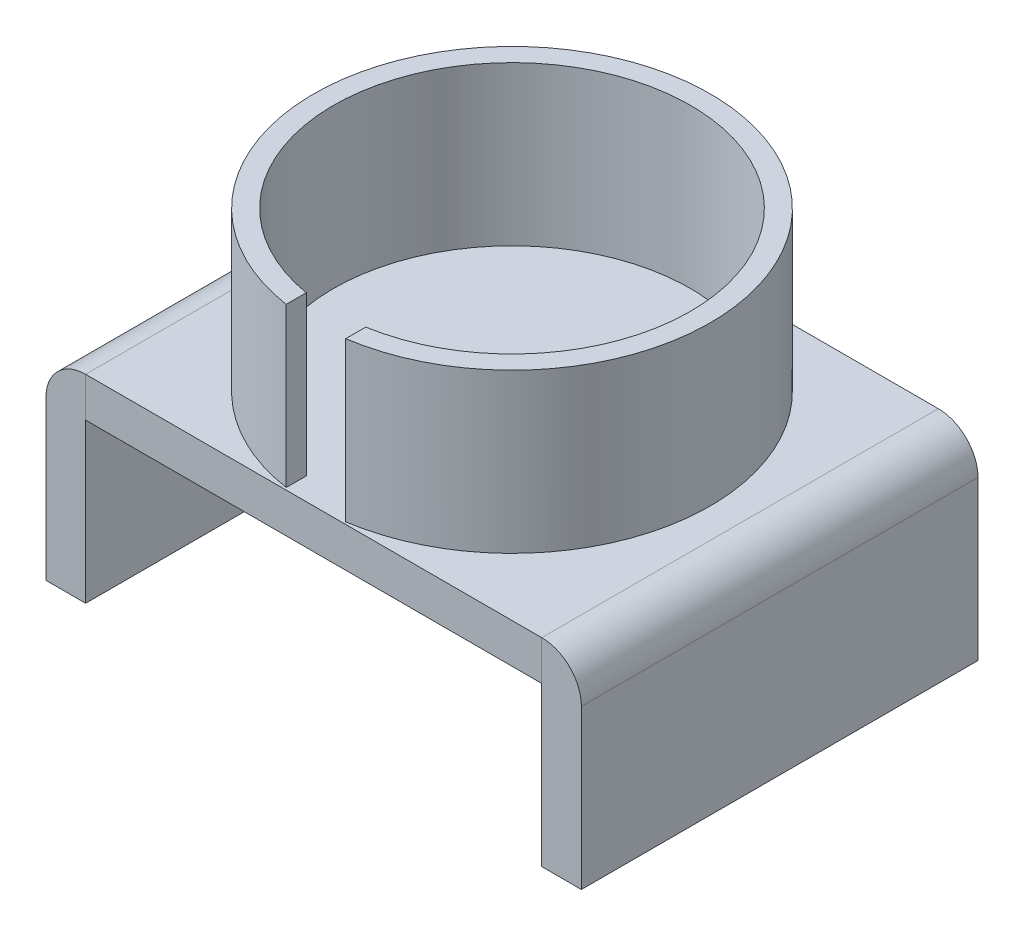
ISO-10303-21;
HEADER;
FILE_DESCRIPTION(('STEP AP214'),'2;1');
FILE_NAME('part.step','',(''),(''),'','','');
FILE_SCHEMA(('AUTOMOTIVE_DESIGN { 1 0 10303 214 1 1 1 1 }'));
ENDSEC;
DATA;
#1=APPLICATION_CONTEXT('core data for automotive mechanical design processes');
#2=APPLICATION_PROTOCOL_DEFINITION('international standard','automotive_design',2000,#1);
#3=PRODUCT_CONTEXT('',#1,'mechanical');
#4=PRODUCT('Part','Part','',(#3));
#5=PRODUCT_RELATED_PRODUCT_CATEGORY('part','',(#4));
#6=PRODUCT_DEFINITION_FORMATION('','',#4);
#7=PRODUCT_DEFINITION_CONTEXT('part definition',#1,'design');
#8=PRODUCT_DEFINITION('design','',#6,#7);
#9=PRODUCT_DEFINITION_SHAPE('','',#8);
#10=(LENGTH_UNIT() NAMED_UNIT(*) SI_UNIT(.MILLI.,.METRE.));
#11=(NAMED_UNIT(*) PLANE_ANGLE_UNIT() SI_UNIT($,.RADIAN.));
#12=(NAMED_UNIT(*) SI_UNIT($,.STERADIAN.) SOLID_ANGLE_UNIT());
#13=UNCERTAINTY_MEASURE_WITH_UNIT(LENGTH_MEASURE(1.E-05),#10,'distance_accuracy_value','');
#14=(GEOMETRIC_REPRESENTATION_CONTEXT(3) GLOBAL_UNCERTAINTY_ASSIGNED_CONTEXT((#13)) GLOBAL_UNIT_ASSIGNED_CONTEXT((#10,
#11,#12)) REPRESENTATION_CONTEXT('',''));
#15=CARTESIAN_POINT('',(0.,0.,0.));
#16=DIRECTION('',(0.,0.,1.));
#17=DIRECTION('',(1.,0.,0.));
#18=AXIS2_PLACEMENT_3D('',#15,#16,#17);
#19=CARTESIAN_POINT('',(-58.307962529274,0.,37.7049180327869));
#20=DIRECTION('',(0.,0.,-1.));
#21=DIRECTION('',(-1.,0.,0.));
#22=AXIS2_PLACEMENT_3D('',#19,#20,#21);
#23=CYLINDRICAL_SURFACE('',#22,10.);
#24=DIRECTION('',(0.,0.,-1.));
#25=VECTOR('',#24,1.);
#26=CARTESIAN_POINT('',(-68.307962529274,0.,37.7049180327869));
#27=LINE('',#26,#25);
#28=CARTESIAN_POINT('',(-68.307962529274,0.,37.7049180327869));
#29=VERTEX_POINT('',#28);
#30=CARTESIAN_POINT('',(-68.307962529274,0.,-62.2950819672131));
#31=VERTEX_POINT('',#30);
#32=EDGE_CURVE('E118',#29,#31,#27,.T.);
#33=ORIENTED_EDGE('',*,*,#32,.F.);
#34=CARTESIAN_POINT('',(-58.307962529274,0.,37.7049180327869));
#35=DIRECTION('',(0.,0.,1.));
#36=DIRECTION('',(1.,0.,0.));
#37=AXIS2_PLACEMENT_3D('',#34,#35,#36);
#38=CIRCLE('',#37,10.);
#39=CARTESIAN_POINT('',(-58.307962529274,10.,37.7049180327869));
#40=VERTEX_POINT('',#39);
#41=EDGE_CURVE('E59',#40,#29,#38,.T.);
#42=ORIENTED_EDGE('',*,*,#41,.F.);
#43=DIRECTION('',(0.,0.,1.));
#44=VECTOR('',#43,1.);
#45=CARTESIAN_POINT('',(-58.307962529274,10.,37.7049180327869));
#46=LINE('',#45,#44);
#47=CARTESIAN_POINT('',(-58.307962529274,10.,-62.2950819672131));
#48=VERTEX_POINT('',#47);
#49=EDGE_CURVE('E95',#48,#40,#46,.T.);
#50=ORIENTED_EDGE('',*,*,#49,.F.);
#51=CARTESIAN_POINT('',(-58.307962529274,0.,-62.2950819672131));
#52=DIRECTION('',(0.,0.,-1.));
#53=DIRECTION('',(-1.,0.,0.));
#54=AXIS2_PLACEMENT_3D('',#51,#52,#53);
#55=CIRCLE('',#54,10.);
#56=EDGE_CURVE('E12',#31,#48,#55,.T.);
#57=ORIENTED_EDGE('',*,*,#56,.F.);
#58=EDGE_LOOP('',(#33,#42,#50,#57));
#59=FACE_BOUND('',#58,.T.);
#60=ADVANCED_FACE('F52',(#59),#23,.T.);
#61=CARTESIAN_POINT('',(-58.307962529274,10.,37.7049180327869));
#62=DIRECTION('',(1.,0.,0.));
#63=DIRECTION('',(0.,0.,-1.));
#64=AXIS2_PLACEMENT_3D('',#61,#62,#63);
#65=PLANE('',#64);
#66=DIRECTION('',(0.,-1.,0.));
#67=VECTOR('',#66,1.);
#68=CARTESIAN_POINT('',(-58.307962529274,10.,37.7049180327869));
#69=LINE('',#68,#67);
#70=CARTESIAN_POINT('',(-58.307962529274,-40.,37.7049180327869));
#71=VERTEX_POINT('',#70);
#72=EDGE_CURVE('E89',#40,#71,#69,.T.);
#73=ORIENTED_EDGE('',*,*,#72,.T.);
#74=DIRECTION('',(0.,0.,1.));
#75=VECTOR('',#74,1.);
#76=CARTESIAN_POINT('',(-58.307962529274,-40.,37.7049180327869));
#77=LINE('',#76,#75);
#78=CARTESIAN_POINT('',(-58.307962529274,-40.,-62.2950819672131));
#79=VERTEX_POINT('',#78);
#80=EDGE_CURVE('E94',#79,#71,#77,.T.);
#81=ORIENTED_EDGE('',*,*,#80,.F.);
#82=DIRECTION('',(0.,-1.,0.));
#83=VECTOR('',#82,1.);
#84=CARTESIAN_POINT('',(-58.307962529274,10.,-62.2950819672131));
#85=LINE('',#84,#83);
#86=EDGE_CURVE('E116',#48,#79,#85,.T.);
#87=ORIENTED_EDGE('',*,*,#86,.F.);
#88=ORIENTED_EDGE('',*,*,#49,.T.);
#89=EDGE_LOOP('',(#73,#81,#87,#88));
#90=FACE_BOUND('',#89,.T.);
#91=ADVANCED_FACE('F91',(#90),#65,.T.);
#92=CARTESIAN_POINT('',(-58.307962529274,10.,-62.2950819672131));
#93=DIRECTION('',(0.,0.,-1.));
#94=DIRECTION('',(-1.,0.,0.));
#95=AXIS2_PLACEMENT_3D('',#92,#93,#94);
#96=PLANE('',#95);
#97=DIRECTION('',(0.,-1.,0.));
#98=VECTOR('',#97,1.);
#99=CARTESIAN_POINT('',(-68.307962529274,10.,-62.2950819672131));
#100=LINE('',#99,#98);
#101=CARTESIAN_POINT('',(-68.307962529274,-40.,-62.2950819672131));
#102=VERTEX_POINT('',#101);
#103=EDGE_CURVE('E119',#31,#102,#100,.T.);
#104=ORIENTED_EDGE('',*,*,#103,.F.);
#105=ORIENTED_EDGE('',*,*,#56,.T.);
#106=ORIENTED_EDGE('',*,*,#86,.T.);
#107=DIRECTION('',(1.,0.,0.));
#108=VECTOR('',#107,1.);
#109=CARTESIAN_POINT('',(-58.307962529274,-40.,-62.2950819672131));
#110=LINE('',#109,#108);
#111=EDGE_CURVE('E110',#102,#79,#110,.T.);
#112=ORIENTED_EDGE('',*,*,#111,.F.);
#113=EDGE_LOOP('',(#104,#105,#106,#112));
#114=FACE_BOUND('',#113,.T.);
#115=ADVANCED_FACE('F126',(#114),#96,.T.);
#116=CARTESIAN_POINT('',(-68.307962529274,10.,37.7049180327869));
#117=DIRECTION('',(-1.,0.,0.));
#118=DIRECTION('',(0.,0.,1.));
#119=AXIS2_PLACEMENT_3D('',#116,#117,#118);
#120=PLANE('',#119);
#121=DIRECTION('',(0.,-1.,0.));
#122=VECTOR('',#121,1.);
#123=CARTESIAN_POINT('',(-68.307962529274,10.,37.7049180327869));
#124=LINE('',#123,#122);
#125=CARTESIAN_POINT('',(-68.307962529274,-40.,37.7049180327869));
#126=VERTEX_POINT('',#125);
#127=EDGE_CURVE('E96',#29,#126,#124,.T.);
#128=ORIENTED_EDGE('',*,*,#127,.F.);
#129=ORIENTED_EDGE('',*,*,#32,.T.);
#130=ORIENTED_EDGE('',*,*,#103,.T.);
#131=DIRECTION('',(0.,0.,-1.));
#132=VECTOR('',#131,1.);
#133=CARTESIAN_POINT('',(-68.307962529274,-40.,37.7049180327869));
#134=LINE('',#133,#132);
#135=EDGE_CURVE('E105',#126,#102,#134,.T.);
#136=ORIENTED_EDGE('',*,*,#135,.F.);
#137=EDGE_LOOP('',(#128,#129,#130,#136));
#138=FACE_BOUND('',#137,.T.);
#139=ADVANCED_FACE('F124',(#138),#120,.T.);
#140=CARTESIAN_POINT('',(-58.307962529274,10.,37.7049180327869));
#141=DIRECTION('',(0.,0.,1.));
#142=DIRECTION('',(1.,0.,0.));
#143=AXIS2_PLACEMENT_3D('',#140,#141,#142);
#144=PLANE('',#143);
#145=ORIENTED_EDGE('',*,*,#72,.F.);
#146=ORIENTED_EDGE('',*,*,#41,.T.);
#147=ORIENTED_EDGE('',*,*,#127,.T.);
#148=DIRECTION('',(-1.,0.,0.));
#149=VECTOR('',#148,1.);
#150=CARTESIAN_POINT('',(-58.307962529274,-40.,37.7049180327869));
#151=LINE('',#150,#149);
#152=EDGE_CURVE('E99',#71,#126,#151,.T.);
#153=ORIENTED_EDGE('',*,*,#152,.F.);
#154=EDGE_LOOP('',(#145,#146,#147,#153));
#155=FACE_BOUND('',#154,.T.);
#156=ADVANCED_FACE('F100',(#155),#144,.T.);
#157=CARTESIAN_POINT('',(0.,-40.,0.));
#158=DIRECTION('',(0.,1.,0.));
#159=DIRECTION('',(0.,0.,1.));
#160=AXIS2_PLACEMENT_3D('',#157,#158,#159);
#161=PLANE('',#160);
#162=ORIENTED_EDGE('',*,*,#80,.T.);
#163=ORIENTED_EDGE('',*,*,#152,.T.);
#164=ORIENTED_EDGE('',*,*,#135,.T.);
#165=ORIENTED_EDGE('',*,*,#111,.T.);
#166=EDGE_LOOP('',(#162,#163,#164,#165));
#167=FACE_BOUND('',#166,.T.);
#168=ADVANCED_FACE('F108',(#167),#161,.F.);
#169=CLOSED_SHELL('',(#60,#91,#115,#139,#156,#168));
#170=MANIFOLD_SOLID_BREP('B2',#169);
#171=CARTESIAN_POINT('',(56.692037470726,0.,0.));
#172=DIRECTION('',(0.,0.,1.));
#173=DIRECTION('',(1.,0.,0.));
#174=AXIS2_PLACEMENT_3D('',#171,#172,#173);
#175=CYLINDRICAL_SURFACE('',#174,10.);
#176=DIRECTION('',(0.,0.,-1.));
#177=VECTOR('',#176,1.);
#178=CARTESIAN_POINT('',(56.692037470726,10.,37.7049180327869));
#179=LINE('',#178,#177);
#180=CARTESIAN_POINT('',(56.692037470726,10.,37.7049180327869));
#181=VERTEX_POINT('',#180);
#182=CARTESIAN_POINT('',(56.692037470726,10.,-62.2950819672131));
#183=VERTEX_POINT('',#182);
#184=EDGE_CURVE('E228',#181,#183,#179,.T.);
#185=ORIENTED_EDGE('',*,*,#184,.F.);
#186=CARTESIAN_POINT('',(56.692037470726,0.,37.7049180327869));
#187=DIRECTION('',(0.,0.,1.));
#188=DIRECTION('',(1.,0.,0.));
#189=AXIS2_PLACEMENT_3D('',#186,#187,#188);
#190=CIRCLE('',#189,10.);
#191=CARTESIAN_POINT('',(66.692037470726,0.,37.7049180327869));
#192=VERTEX_POINT('',#191);
#193=EDGE_CURVE('E192',#192,#181,#190,.T.);
#194=ORIENTED_EDGE('',*,*,#193,.F.);
#195=DIRECTION('',(0.,0.,-1.));
#196=VECTOR('',#195,1.);
#197=CARTESIAN_POINT('',(66.692037470726,0.,0.));
#198=LINE('',#197,#196);
#199=CARTESIAN_POINT('',(66.692037470726,0.,-62.2950819672131));
#200=VERTEX_POINT('',#199);
#201=EDGE_CURVE('E251',#200,#192,#198,.F.);
#202=ORIENTED_EDGE('',*,*,#201,.F.);
#203=CARTESIAN_POINT('',(56.692037470726,0.,-62.2950819672131));
#204=DIRECTION('',(0.,0.,-1.));
#205=DIRECTION('',(-1.,0.,0.));
#206=AXIS2_PLACEMENT_3D('',#203,#204,#205);
#207=CIRCLE('',#206,10.);
#208=EDGE_CURVE('E50',#183,#200,#207,.T.);
#209=ORIENTED_EDGE('',*,*,#208,.F.);
#210=EDGE_LOOP('',(#185,#194,#202,#209));
#211=FACE_BOUND('',#210,.T.);
#212=ADVANCED_FACE('F185',(#211),#175,.T.);
#213=CARTESIAN_POINT('',(56.692037470726,10.,37.7049180327869));
#214=DIRECTION('',(-1.,0.,0.));
#215=DIRECTION('',(0.,0.,1.));
#216=AXIS2_PLACEMENT_3D('',#213,#214,#215);
#217=PLANE('',#216);
#218=DIRECTION('',(0.,-1.,0.));
#219=VECTOR('',#218,1.);
#220=CARTESIAN_POINT('',(56.692037470726,10.,-62.2950819672131));
#221=LINE('',#220,#219);
#222=CARTESIAN_POINT('',(56.692037470726,-40.,-62.2950819672131));
#223=VERTEX_POINT('',#222);
#224=EDGE_CURVE('E222',#183,#223,#221,.T.);
#225=ORIENTED_EDGE('',*,*,#224,.T.);
#226=DIRECTION('',(0.,0.,-1.));
#227=VECTOR('',#226,1.);
#228=CARTESIAN_POINT('',(56.692037470726,-40.,37.7049180327869));
#229=LINE('',#228,#227);
#230=CARTESIAN_POINT('',(56.692037470726,-40.,37.7049180327869));
#231=VERTEX_POINT('',#230);
#232=EDGE_CURVE('E227',#231,#223,#229,.T.);
#233=ORIENTED_EDGE('',*,*,#232,.F.);
#234=DIRECTION('',(0.,-1.,0.));
#235=VECTOR('',#234,1.);
#236=CARTESIAN_POINT('',(56.692037470726,10.,37.7049180327869));
#237=LINE('',#236,#235);
#238=EDGE_CURVE('E249',#181,#231,#237,.T.);
#239=ORIENTED_EDGE('',*,*,#238,.F.);
#240=ORIENTED_EDGE('',*,*,#184,.T.);
#241=EDGE_LOOP('',(#225,#233,#239,#240));
#242=FACE_BOUND('',#241,.T.);
#243=ADVANCED_FACE('F224',(#242),#217,.T.);
#244=CARTESIAN_POINT('',(56.692037470726,10.,37.7049180327869));
#245=DIRECTION('',(0.,0.,1.));
#246=DIRECTION('',(1.,0.,0.));
#247=AXIS2_PLACEMENT_3D('',#244,#245,#246);
#248=PLANE('',#247);
#249=DIRECTION('',(0.,-1.,0.));
#250=VECTOR('',#249,1.);
#251=CARTESIAN_POINT('',(66.692037470726,10.,37.7049180327869));
#252=LINE('',#251,#250);
#253=CARTESIAN_POINT('',(66.692037470726,-40.,37.7049180327869));
#254=VERTEX_POINT('',#253);
#255=EDGE_CURVE('E252',#192,#254,#252,.T.);
#256=ORIENTED_EDGE('',*,*,#255,.F.);
#257=ORIENTED_EDGE('',*,*,#193,.T.);
#258=ORIENTED_EDGE('',*,*,#238,.T.);
#259=DIRECTION('',(-1.,0.,0.));
#260=VECTOR('',#259,1.);
#261=CARTESIAN_POINT('',(56.692037470726,-40.,37.7049180327869));
#262=LINE('',#261,#260);
#263=EDGE_CURVE('E243',#254,#231,#262,.T.);
#264=ORIENTED_EDGE('',*,*,#263,.F.);
#265=EDGE_LOOP('',(#256,#257,#258,#264));
#266=FACE_BOUND('',#265,.T.);
#267=ADVANCED_FACE('F257',(#266),#248,.T.);
#268=CARTESIAN_POINT('',(66.692037470726,10.,37.7049180327869));
#269=DIRECTION('',(1.,0.,0.));
#270=DIRECTION('',(0.,0.,-1.));
#271=AXIS2_PLACEMENT_3D('',#268,#269,#270);
#272=PLANE('',#271);
#273=DIRECTION('',(0.,-1.,0.));
#274=VECTOR('',#273,1.);
#275=CARTESIAN_POINT('',(66.692037470726,10.,-62.2950819672131));
#276=LINE('',#275,#274);
#277=CARTESIAN_POINT('',(66.692037470726,-40.,-62.2950819672131));
#278=VERTEX_POINT('',#277);
#279=EDGE_CURVE('E229',#200,#278,#276,.T.);
#280=ORIENTED_EDGE('',*,*,#279,.F.);
#281=ORIENTED_EDGE('',*,*,#201,.T.);
#282=ORIENTED_EDGE('',*,*,#255,.T.);
#283=DIRECTION('',(0.,0.,1.));
#284=VECTOR('',#283,1.);
#285=CARTESIAN_POINT('',(66.692037470726,-40.,37.7049180327869));
#286=LINE('',#285,#284);
#287=EDGE_CURVE('E238',#278,#254,#286,.T.);
#288=ORIENTED_EDGE('',*,*,#287,.F.);
#289=EDGE_LOOP('',(#280,#281,#282,#288));
#290=FACE_BOUND('',#289,.T.);
#291=ADVANCED_FACE('F259',(#290),#272,.T.);
#292=CARTESIAN_POINT('',(56.692037470726,10.,-62.2950819672131));
#293=DIRECTION('',(0.,0.,-1.));
#294=DIRECTION('',(-1.,0.,0.));
#295=AXIS2_PLACEMENT_3D('',#292,#293,#294);
#296=PLANE('',#295);
#297=ORIENTED_EDGE('',*,*,#224,.F.);
#298=ORIENTED_EDGE('',*,*,#208,.T.);
#299=ORIENTED_EDGE('',*,*,#279,.T.);
#300=DIRECTION('',(1.,0.,0.));
#301=VECTOR('',#300,1.);
#302=CARTESIAN_POINT('',(56.692037470726,-40.,-62.2950819672131));
#303=LINE('',#302,#301);
#304=EDGE_CURVE('E232',#223,#278,#303,.T.);
#305=ORIENTED_EDGE('',*,*,#304,.F.);
#306=EDGE_LOOP('',(#297,#298,#299,#305));
#307=FACE_BOUND('',#306,.T.);
#308=ADVANCED_FACE('F233',(#307),#296,.T.);
#309=CARTESIAN_POINT('',(0.,-40.,0.));
#310=DIRECTION('',(0.,-1.,0.));
#311=DIRECTION('',(0.,0.,-1.));
#312=AXIS2_PLACEMENT_3D('',#309,#310,#311);
#313=PLANE('',#312);
#314=ORIENTED_EDGE('',*,*,#232,.T.);
#315=ORIENTED_EDGE('',*,*,#304,.T.);
#316=ORIENTED_EDGE('',*,*,#287,.T.);
#317=ORIENTED_EDGE('',*,*,#263,.T.);
#318=EDGE_LOOP('',(#314,#315,#316,#317));
#319=FACE_BOUND('',#318,.T.);
#320=ADVANCED_FACE('F241',(#319),#313,.T.);
#321=CLOSED_SHELL('',(#212,#243,#267,#291,#308,#320));
#322=MANIFOLD_SOLID_BREP('B6',#321);
#323=CARTESIAN_POINT('',(-58.307962529274,10.,-62.2950819672131));
#324=DIRECTION('',(1.,0.,0.));
#325=DIRECTION('',(0.,0.,-1.));
#326=AXIS2_PLACEMENT_3D('',#323,#324,#325);
#327=PLANE('',#326);
#328=DIRECTION('',(0.,0.,1.));
#329=VECTOR('',#328,1.);
#330=CARTESIAN_POINT('',(-58.307962529274,0.,-62.2950819672131));
#331=LINE('',#330,#329);
#332=CARTESIAN_POINT('',(-58.307962529274,0.,-62.2950819672131));
#333=VERTEX_POINT('',#332);
#334=CARTESIAN_POINT('',(-58.307962529274,0.,37.7049180327869));
#335=VERTEX_POINT('',#334);
#336=EDGE_CURVE('E402',#333,#335,#331,.T.);
#337=ORIENTED_EDGE('',*,*,#336,.T.);
#338=DIRECTION('',(0.,-1.,0.));
#339=VECTOR('',#338,1.);
#340=CARTESIAN_POINT('',(-58.307962529274,10.,37.7049180327869));
#341=LINE('',#340,#339);
#342=CARTESIAN_POINT('',(-58.307962529274,10.,37.7049180327869));
#343=VERTEX_POINT('',#342);
#344=EDGE_CURVE('E312',#343,#335,#341,.T.);
#345=ORIENTED_EDGE('',*,*,#344,.F.);
#346=DIRECTION('',(0.,0.,1.));
#347=VECTOR('',#346,1.);
#348=CARTESIAN_POINT('',(-58.307962529274,10.,-62.2950819672131));
#349=LINE('',#348,#347);
#350=CARTESIAN_POINT('',(-58.307962529274,10.,-62.2950819672131));
#351=VERTEX_POINT('',#350);
#352=EDGE_CURVE('E413',#351,#343,#349,.T.);
#353=ORIENTED_EDGE('',*,*,#352,.F.);
#354=DIRECTION('',(0.,-1.,0.));
#355=VECTOR('',#354,1.);
#356=CARTESIAN_POINT('',(-58.307962529274,10.,-62.2950819672131));
#357=LINE('',#356,#355);
#358=EDGE_CURVE('E428',#351,#333,#357,.T.);
#359=ORIENTED_EDGE('',*,*,#358,.T.);
#360=EDGE_LOOP('',(#337,#345,#353,#359));
#361=FACE_BOUND('',#360,.T.);
#362=ADVANCED_FACE('F309',(#361),#327,.F.);
#363=CARTESIAN_POINT('',(-58.307962529274,10.,37.7049180327869));
#364=DIRECTION('',(0.,0.,-1.));
#365=DIRECTION('',(-1.,0.,0.));
#366=AXIS2_PLACEMENT_3D('',#363,#364,#365);
#367=PLANE('',#366);
#368=DIRECTION('',(1.,0.,0.));
#369=VECTOR('',#368,1.);
#370=CARTESIAN_POINT('',(-58.307962529274,0.,37.7049180327869));
#371=LINE('',#370,#369);
#372=CARTESIAN_POINT('',(56.692037470726,0.,37.7049180327869));
#373=VERTEX_POINT('',#372);
#374=EDGE_CURVE('E407',#335,#373,#371,.T.);
#375=ORIENTED_EDGE('',*,*,#374,.T.);
#376=DIRECTION('',(0.,-1.,0.));
#377=VECTOR('',#376,1.);
#378=CARTESIAN_POINT('',(56.692037470726,10.,37.7049180327869));
#379=LINE('',#378,#377);
#380=CARTESIAN_POINT('',(56.692037470726,10.,37.7049180327869));
#381=VERTEX_POINT('',#380);
#382=EDGE_CURVE('E443',#381,#373,#379,.T.);
#383=ORIENTED_EDGE('',*,*,#382,.F.);
#384=DIRECTION('',(1.,0.,0.));
#385=VECTOR('',#384,1.);
#386=CARTESIAN_POINT('',(-58.307962529274,10.,37.7049180327869));
#387=LINE('',#386,#385);
#388=EDGE_CURVE('E417',#343,#381,#387,.T.);
#389=ORIENTED_EDGE('',*,*,#388,.F.);
#390=ORIENTED_EDGE('',*,*,#344,.T.);
#391=EDGE_LOOP('',(#375,#383,#389,#390));
#392=FACE_BOUND('',#391,.T.);
#393=ADVANCED_FACE('F454',(#392),#367,.F.);
#394=CARTESIAN_POINT('',(56.692037470726,10.,-62.2950819672131));
#395=DIRECTION('',(-1.,0.,0.));
#396=DIRECTION('',(0.,0.,1.));
#397=AXIS2_PLACEMENT_3D('',#394,#395,#396);
#398=PLANE('',#397);
#399=DIRECTION('',(0.,0.,-1.));
#400=VECTOR('',#399,1.);
#401=CARTESIAN_POINT('',(56.692037470726,0.,-62.2950819672131));
#402=LINE('',#401,#400);
#403=CARTESIAN_POINT('',(56.692037470726,0.,-62.2950819672131));
#404=VERTEX_POINT('',#403);
#405=EDGE_CURVE('E432',#373,#404,#402,.T.);
#406=ORIENTED_EDGE('',*,*,#405,.T.);
#407=DIRECTION('',(0.,-1.,0.));
#408=VECTOR('',#407,1.);
#409=CARTESIAN_POINT('',(56.692037470726,10.,-62.2950819672131));
#410=LINE('',#409,#408);
#411=CARTESIAN_POINT('',(56.692037470726,10.,-62.2950819672131));
#412=VERTEX_POINT('',#411);
#413=EDGE_CURVE('E440',#412,#404,#410,.T.);
#414=ORIENTED_EDGE('',*,*,#413,.F.);
#415=DIRECTION('',(0.,0.,-1.));
#416=VECTOR('',#415,1.);
#417=CARTESIAN_POINT('',(56.692037470726,10.,-62.2950819672131));
#418=LINE('',#417,#416);
#419=EDGE_CURVE('E421',#381,#412,#418,.T.);
#420=ORIENTED_EDGE('',*,*,#419,.F.);
#421=ORIENTED_EDGE('',*,*,#382,.T.);
#422=EDGE_LOOP('',(#406,#414,#420,#421));
#423=FACE_BOUND('',#422,.T.);
#424=ADVANCED_FACE('F463',(#423),#398,.F.);
#425=CARTESIAN_POINT('',(-58.307962529274,10.,-62.2950819672131));
#426=DIRECTION('',(0.,0.,1.));
#427=DIRECTION('',(1.,0.,0.));
#428=AXIS2_PLACEMENT_3D('',#425,#426,#427);
#429=PLANE('',#428);
#430=DIRECTION('',(-1.,0.,0.));
#431=VECTOR('',#430,1.);
#432=CARTESIAN_POINT('',(-58.307962529274,0.,-62.2950819672131));
#433=LINE('',#432,#431);
#434=EDGE_CURVE('E418',#404,#333,#433,.T.);
#435=ORIENTED_EDGE('',*,*,#434,.T.);
#436=ORIENTED_EDGE('',*,*,#358,.F.);
#437=DIRECTION('',(-1.,0.,0.));
#438=VECTOR('',#437,1.);
#439=CARTESIAN_POINT('',(-58.307962529274,10.,-62.2950819672131));
#440=LINE('',#439,#438);
#441=CARTESIAN_POINT('',(-0.807962529274044,10.,-62.2950819672131));
#442=VERTEX_POINT('',#441);
#443=EDGE_CURVE('E424',#442,#351,#440,.T.);
#444=ORIENTED_EDGE('',*,*,#443,.F.);
#445=EDGE_CURVE('E425',#412,#442,#440,.T.);
#446=ORIENTED_EDGE('',*,*,#445,.F.);
#447=ORIENTED_EDGE('',*,*,#413,.T.);
#448=EDGE_LOOP('',(#435,#436,#444,#446,#447));
#449=FACE_BOUND('',#448,.T.);
#450=ADVANCED_FACE('F466',(#449),#429,.F.);
#451=CARTESIAN_POINT('',(0.,10.,0.));
#452=DIRECTION('',(0.,1.,0.));
#453=DIRECTION('',(0.,0.,1.));
#454=AXIS2_PLACEMENT_3D('',#451,#452,#453);
#455=PLANE('',#454);
#456=DIRECTION('',(0.,0.,1.));
#457=VECTOR('',#456,1.);
#458=CARTESIAN_POINT('',(6.69203747072596,10.,0.));
#459=LINE('',#458,#457);
#460=CARTESIAN_POINT('',(6.69203747072596,10.,32.075516406034));
#461=VERTEX_POINT('',#460);
#462=CARTESIAN_POINT('',(6.69203747072596,10.,37.1392178659999));
#463=VERTEX_POINT('',#462);
#464=EDGE_CURVE('E326',#461,#463,#459,.T.);
#465=ORIENTED_EDGE('',*,*,#464,.F.);
#466=CARTESIAN_POINT('',(-0.807962529274044,10.,-12.2950819672131));
#467=DIRECTION('',(0.,1.,0.));
#468=DIRECTION('',(0.,0.,1.));
#469=AXIS2_PLACEMENT_3D('',#466,#467,#468);
#470=CIRCLE('',#469,45.);
#471=CARTESIAN_POINT('',(-8.30796252927403,10.,32.075516406034));
#472=VERTEX_POINT('',#471);
#473=EDGE_CURVE('E331',#461,#472,#470,.T.);
#474=ORIENTED_EDGE('',*,*,#473,.T.);
#475=DIRECTION('',(0.,0.,-1.));
#476=VECTOR('',#475,1.);
#477=CARTESIAN_POINT('',(-8.30796252927403,10.,0.));
#478=LINE('',#477,#476);
#479=CARTESIAN_POINT('',(-8.30796252927403,10.,37.1392178659999));
#480=VERTEX_POINT('',#479);
#481=EDGE_CURVE('E470',#480,#472,#478,.T.);
#482=ORIENTED_EDGE('',*,*,#481,.F.);
#483=CARTESIAN_POINT('',(-0.807962529274044,10.,-12.2950819672131));
#484=DIRECTION('',(0.,1.,0.));
#485=DIRECTION('',(0.,0.,1.));
#486=AXIS2_PLACEMENT_3D('',#483,#484,#485);
#487=CIRCLE('',#486,50.);
#488=EDGE_CURVE('E183',#442,#480,#487,.T.);
#489=ORIENTED_EDGE('',*,*,#488,.F.);
#490=ORIENTED_EDGE('',*,*,#443,.T.);
#491=ORIENTED_EDGE('',*,*,#352,.T.);
#492=ORIENTED_EDGE('',*,*,#388,.T.);
#493=ORIENTED_EDGE('',*,*,#419,.T.);
#494=ORIENTED_EDGE('',*,*,#445,.T.);
#495=EDGE_CURVE('E319',#463,#442,#487,.T.);
#496=ORIENTED_EDGE('',*,*,#495,.F.);
#497=EDGE_LOOP('',(#465,#474,#482,#489,#490,#491,#492,#493,#494,#496));
#498=FACE_BOUND('',#497,.T.);
#499=ADVANCED_FACE('F468',(#498),#455,.T.);
#500=CARTESIAN_POINT('',(0.,0.,0.));
#501=DIRECTION('',(0.,1.,0.));
#502=DIRECTION('',(0.,0.,1.));
#503=AXIS2_PLACEMENT_3D('',#500,#501,#502);
#504=PLANE('',#503);
#505=ORIENTED_EDGE('',*,*,#336,.F.);
#506=ORIENTED_EDGE('',*,*,#434,.F.);
#507=ORIENTED_EDGE('',*,*,#405,.F.);
#508=ORIENTED_EDGE('',*,*,#374,.F.);
#509=EDGE_LOOP('',(#505,#506,#507,#508));
#510=FACE_BOUND('',#509,.T.);
#511=ADVANCED_FACE('F461',(#510),#504,.F.);
#512=CARTESIAN_POINT('',(6.69203747072596,50.,0.));
#513=DIRECTION('',(1.,0.,0.));
#514=DIRECTION('',(0.,0.,-1.));
#515=AXIS2_PLACEMENT_3D('',#512,#513,#514);
#516=PLANE('',#515);
#517=ORIENTED_EDGE('',*,*,#464,.T.);
#518=DIRECTION('',(0.,-1.,0.));
#519=VECTOR('',#518,1.);
#520=CARTESIAN_POINT('',(6.69203747072596,50.,37.1392178659999));
#521=LINE('',#520,#519);
#522=CARTESIAN_POINT('',(6.69203747072596,50.,37.1392178659999));
#523=VERTEX_POINT('',#522);
#524=EDGE_CURVE('E383',#523,#463,#521,.T.);
#525=ORIENTED_EDGE('',*,*,#524,.F.);
#526=DIRECTION('',(0.,0.,1.));
#527=VECTOR('',#526,1.);
#528=CARTESIAN_POINT('',(6.69203747072596,50.,0.));
#529=LINE('',#528,#527);
#530=CARTESIAN_POINT('',(6.69203747072596,50.,32.075516406034));
#531=VERTEX_POINT('',#530);
#532=EDGE_CURVE('E390',#531,#523,#529,.T.);
#533=ORIENTED_EDGE('',*,*,#532,.F.);
#534=DIRECTION('',(0.,-1.,0.));
#535=VECTOR('',#534,1.);
#536=CARTESIAN_POINT('',(6.69203747072596,50.,32.075516406034));
#537=LINE('',#536,#535);
#538=EDGE_CURVE('E480',#531,#461,#537,.T.);
#539=ORIENTED_EDGE('',*,*,#538,.T.);
#540=EDGE_LOOP('',(#517,#525,#533,#539));
#541=FACE_BOUND('',#540,.T.);
#542=ADVANCED_FACE('F400',(#541),#516,.F.);
#543=CARTESIAN_POINT('',(-0.807962529274044,50.,-12.2950819672131));
#544=DIRECTION('',(0.,-1.,0.));
#545=DIRECTION('',(0.,0.,-1.));
#546=AXIS2_PLACEMENT_3D('',#543,#544,#545);
#547=CYLINDRICAL_SURFACE('',#546,50.);
#548=ORIENTED_EDGE('',*,*,#495,.T.);
#549=ORIENTED_EDGE('',*,*,#488,.T.);
#550=DIRECTION('',(0.,-1.,0.));
#551=VECTOR('',#550,1.);
#552=CARTESIAN_POINT('',(-8.30796252927403,50.,37.1392178659999));
#553=LINE('',#552,#551);
#554=CARTESIAN_POINT('',(-8.30796252927403,50.,37.1392178659999));
#555=VERTEX_POINT('',#554);
#556=EDGE_CURVE('E385',#555,#480,#553,.T.);
#557=ORIENTED_EDGE('',*,*,#556,.F.);
#558=CARTESIAN_POINT('',(-0.807962529274044,50.,-12.2950819672131));
#559=DIRECTION('',(0.,1.,0.));
#560=DIRECTION('',(0.,0.,1.));
#561=AXIS2_PLACEMENT_3D('',#558,#559,#560);
#562=CIRCLE('',#561,50.);
#563=EDGE_CURVE('E378',#523,#555,#562,.T.);
#564=ORIENTED_EDGE('',*,*,#563,.F.);
#565=ORIENTED_EDGE('',*,*,#524,.T.);
#566=EDGE_LOOP('',(#548,#549,#557,#564,#565));
#567=FACE_BOUND('',#566,.T.);
#568=ADVANCED_FACE('F381',(#567),#547,.T.);
#569=CARTESIAN_POINT('',(-8.30796252927403,50.,0.));
#570=DIRECTION('',(-1.,0.,0.));
#571=DIRECTION('',(0.,0.,1.));
#572=AXIS2_PLACEMENT_3D('',#569,#570,#571);
#573=PLANE('',#572);
#574=ORIENTED_EDGE('',*,*,#481,.T.);
#575=DIRECTION('',(0.,-1.,0.));
#576=VECTOR('',#575,1.);
#577=CARTESIAN_POINT('',(-8.30796252927403,50.,32.075516406034));
#578=LINE('',#577,#576);
#579=CARTESIAN_POINT('',(-8.30796252927403,50.,32.075516406034));
#580=VERTEX_POINT('',#579);
#581=EDGE_CURVE('E409',#580,#472,#578,.T.);
#582=ORIENTED_EDGE('',*,*,#581,.F.);
#583=DIRECTION('',(0.,0.,-1.));
#584=VECTOR('',#583,1.);
#585=CARTESIAN_POINT('',(-8.30796252927403,50.,0.));
#586=LINE('',#585,#584);
#587=EDGE_CURVE('E389',#555,#580,#586,.T.);
#588=ORIENTED_EDGE('',*,*,#587,.F.);
#589=ORIENTED_EDGE('',*,*,#556,.T.);
#590=EDGE_LOOP('',(#574,#582,#588,#589));
#591=FACE_BOUND('',#590,.T.);
#592=ADVANCED_FACE('F487',(#591),#573,.F.);
#593=CARTESIAN_POINT('',(-0.807962529274044,50.,-12.2950819672131));
#594=DIRECTION('',(0.,-1.,0.));
#595=DIRECTION('',(0.,0.,-1.));
#596=AXIS2_PLACEMENT_3D('',#593,#594,#595);
#597=CYLINDRICAL_SURFACE('',#596,45.);
#598=ORIENTED_EDGE('',*,*,#473,.F.);
#599=ORIENTED_EDGE('',*,*,#538,.F.);
#600=CARTESIAN_POINT('',(-0.807962529274044,50.,-12.2950819672131));
#601=DIRECTION('',(0.,1.,0.));
#602=DIRECTION('',(0.,0.,1.));
#603=AXIS2_PLACEMENT_3D('',#600,#601,#602);
#604=CIRCLE('',#603,45.);
#605=EDGE_CURVE('E396',#531,#580,#604,.T.);
#606=ORIENTED_EDGE('',*,*,#605,.T.);
#607=ORIENTED_EDGE('',*,*,#581,.T.);
#608=EDGE_LOOP('',(#598,#599,#606,#607));
#609=FACE_BOUND('',#608,.T.);
#610=ADVANCED_FACE('F485',(#609),#597,.F.);
#611=CARTESIAN_POINT('',(0.,50.,0.));
#612=DIRECTION('',(0.,1.,0.));
#613=DIRECTION('',(0.,0.,1.));
#614=AXIS2_PLACEMENT_3D('',#611,#612,#613);
#615=PLANE('',#614);
#616=ORIENTED_EDGE('',*,*,#532,.T.);
#617=ORIENTED_EDGE('',*,*,#563,.T.);
#618=ORIENTED_EDGE('',*,*,#587,.T.);
#619=ORIENTED_EDGE('',*,*,#605,.F.);
#620=EDGE_LOOP('',(#616,#617,#618,#619));
#621=FACE_BOUND('',#620,.T.);
#622=ADVANCED_FACE('F394',(#621),#615,.T.);
#623=CLOSED_SHELL('',(#362,#393,#424,#450,#499,#511,#542,#568,#592,#610,#622));
#624=MANIFOLD_SOLID_BREP('B44',#623);
#625=ADVANCED_BREP_SHAPE_REPRESENTATION('',(#18,#170,#322,#624),#14);
#626=SHAPE_DEFINITION_REPRESENTATION(#9,#625);
ENDSEC;
END-ISO-10303-21;
